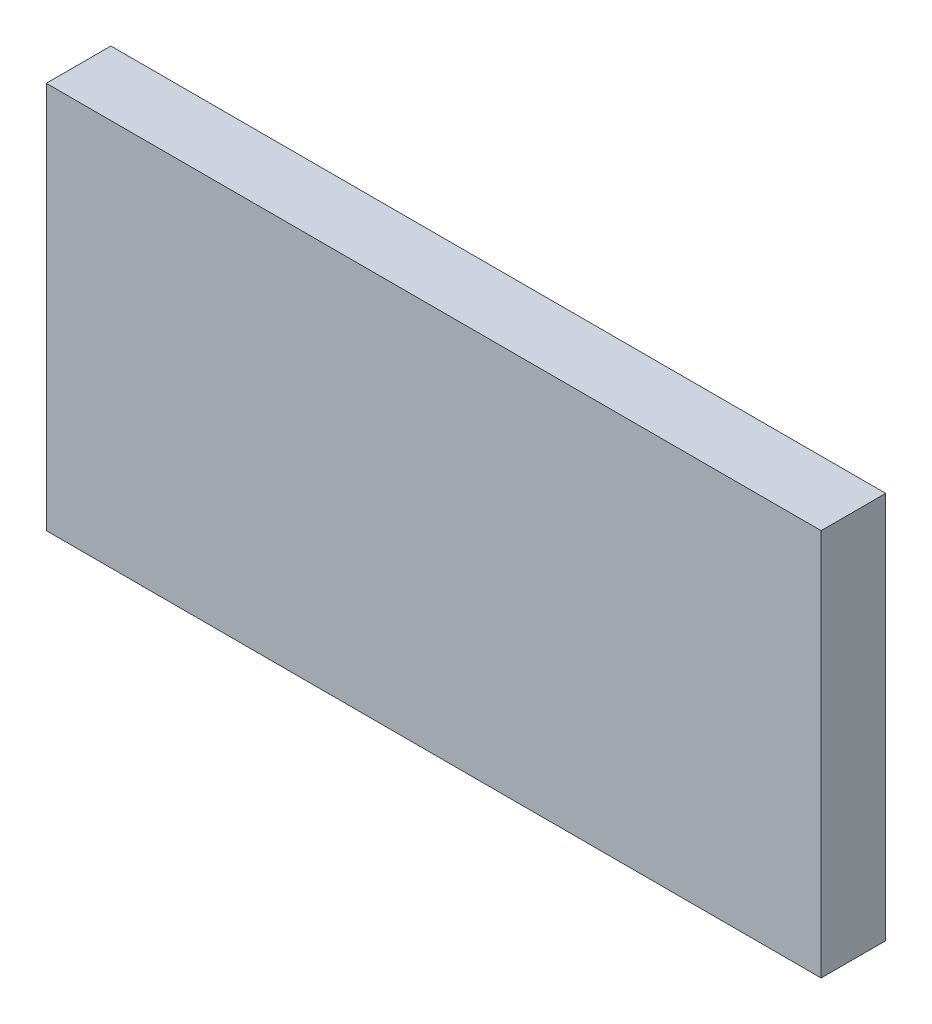
ISO-10303-21;
HEADER;
FILE_DESCRIPTION(('STEP AP214'),'2;1');
FILE_NAME('part.step','',(''),(''),'','','');
FILE_SCHEMA(('AUTOMOTIVE_DESIGN { 1 0 10303 214 1 1 1 1 }'));
ENDSEC;
DATA;
#1=APPLICATION_CONTEXT('core data for automotive mechanical design processes');
#2=APPLICATION_PROTOCOL_DEFINITION('international standard','automotive_design',2000,#1);
#3=PRODUCT_CONTEXT('',#1,'mechanical');
#4=PRODUCT('Part','Part','',(#3));
#5=PRODUCT_RELATED_PRODUCT_CATEGORY('part','',(#4));
#6=PRODUCT_DEFINITION_FORMATION('','',#4);
#7=PRODUCT_DEFINITION_CONTEXT('part definition',#1,'design');
#8=PRODUCT_DEFINITION('design','',#6,#7);
#9=PRODUCT_DEFINITION_SHAPE('','',#8);
#10=(LENGTH_UNIT() NAMED_UNIT(*) SI_UNIT(.MILLI.,.METRE.));
#11=(NAMED_UNIT(*) PLANE_ANGLE_UNIT() SI_UNIT($,.RADIAN.));
#12=(NAMED_UNIT(*) SI_UNIT($,.STERADIAN.) SOLID_ANGLE_UNIT());
#13=UNCERTAINTY_MEASURE_WITH_UNIT(LENGTH_MEASURE(1.E-05),#10,'distance_accuracy_value','');
#14=(GEOMETRIC_REPRESENTATION_CONTEXT(3) GLOBAL_UNCERTAINTY_ASSIGNED_CONTEXT((#13)) GLOBAL_UNIT_ASSIGNED_CONTEXT((#10,
#11,#12)) REPRESENTATION_CONTEXT('',''));
#15=CARTESIAN_POINT('',(0.,0.,0.));
#16=DIRECTION('',(0.,0.,1.));
#17=DIRECTION('',(1.,0.,0.));
#18=AXIS2_PLACEMENT_3D('',#15,#16,#17);
#19=CARTESIAN_POINT('',(60.,30.,10.));
#20=DIRECTION('',(-1.,0.,0.));
#21=DIRECTION('',(0.,-1.,0.));
#22=AXIS2_PLACEMENT_3D('',#19,#20,#21);
#23=PLANE('',#22);
#24=DIRECTION('',(0.,1.,0.));
#25=VECTOR('',#24,1.);
#26=CARTESIAN_POINT('',(60.,30.,0.));
#27=LINE('',#26,#25);
#28=CARTESIAN_POINT('',(60.,-30.,0.));
#29=VERTEX_POINT('',#28);
#30=CARTESIAN_POINT('',(60.,30.,0.));
#31=VERTEX_POINT('',#30);
#32=EDGE_CURVE('E104',#29,#31,#27,.T.);
#33=ORIENTED_EDGE('',*,*,#32,.T.);
#34=DIRECTION('',(0.,0.,-1.));
#35=VECTOR('',#34,1.);
#36=CARTESIAN_POINT('',(60.,30.,10.));
#37=LINE('',#36,#35);
#38=CARTESIAN_POINT('',(60.,30.,10.));
#39=VERTEX_POINT('',#38);
#40=EDGE_CURVE('E11',#39,#31,#37,.T.);
#41=ORIENTED_EDGE('',*,*,#40,.F.);
#42=DIRECTION('',(0.,1.,0.));
#43=VECTOR('',#42,1.);
#44=CARTESIAN_POINT('',(60.,30.,10.));
#45=LINE('',#44,#43);
#46=CARTESIAN_POINT('',(60.,-30.,10.));
#47=VERTEX_POINT('',#46);
#48=EDGE_CURVE('E92',#47,#39,#45,.T.);
#49=ORIENTED_EDGE('',*,*,#48,.F.);
#50=DIRECTION('',(0.,0.,-1.));
#51=VECTOR('',#50,1.);
#52=CARTESIAN_POINT('',(60.,-30.,10.));
#53=LINE('',#52,#51);
#54=EDGE_CURVE('E100',#47,#29,#53,.T.);
#55=ORIENTED_EDGE('',*,*,#54,.T.);
#56=EDGE_LOOP('',(#33,#41,#49,#55));
#57=FACE_BOUND('',#56,.T.);
#58=ADVANCED_FACE('F41',(#57),#23,.F.);
#59=CARTESIAN_POINT('',(-60.,30.,10.));
#60=DIRECTION('',(0.,-1.,0.));
#61=DIRECTION('',(0.,0.,-1.));
#62=AXIS2_PLACEMENT_3D('',#59,#60,#61);
#63=PLANE('',#62);
#64=DIRECTION('',(-1.,0.,0.));
#65=VECTOR('',#64,1.);
#66=CARTESIAN_POINT('',(-60.,30.,0.));
#67=LINE('',#66,#65);
#68=CARTESIAN_POINT('',(-60.,30.,0.));
#69=VERTEX_POINT('',#68);
#70=EDGE_CURVE('E96',#31,#69,#67,.T.);
#71=ORIENTED_EDGE('',*,*,#70,.T.);
#72=DIRECTION('',(0.,0.,-1.));
#73=VECTOR('',#72,1.);
#74=CARTESIAN_POINT('',(-60.,30.,10.));
#75=LINE('',#74,#73);
#76=CARTESIAN_POINT('',(-60.,30.,10.));
#77=VERTEX_POINT('',#76);
#78=EDGE_CURVE('E49',#77,#69,#75,.T.);
#79=ORIENTED_EDGE('',*,*,#78,.F.);
#80=DIRECTION('',(-1.,0.,0.));
#81=VECTOR('',#80,1.);
#82=CARTESIAN_POINT('',(-60.,30.,10.));
#83=LINE('',#82,#81);
#84=EDGE_CURVE('E87',#39,#77,#83,.T.);
#85=ORIENTED_EDGE('',*,*,#84,.F.);
#86=ORIENTED_EDGE('',*,*,#40,.T.);
#87=EDGE_LOOP('',(#71,#79,#85,#86));
#88=FACE_BOUND('',#87,.T.);
#89=ADVANCED_FACE('F95',(#88),#63,.F.);
#90=CARTESIAN_POINT('',(-60.,30.,10.));
#91=DIRECTION('',(1.,0.,0.));
#92=DIRECTION('',(0.,1.,0.));
#93=AXIS2_PLACEMENT_3D('',#90,#91,#92);
#94=PLANE('',#93);
#95=DIRECTION('',(0.,-1.,0.));
#96=VECTOR('',#95,1.);
#97=CARTESIAN_POINT('',(-60.,30.,0.));
#98=LINE('',#97,#96);
#99=CARTESIAN_POINT('',(-60.,-30.,0.));
#100=VERTEX_POINT('',#99);
#101=EDGE_CURVE('E74',#69,#100,#98,.T.);
#102=ORIENTED_EDGE('',*,*,#101,.T.);
#103=DIRECTION('',(0.,0.,-1.));
#104=VECTOR('',#103,1.);
#105=CARTESIAN_POINT('',(-60.,-30.,10.));
#106=LINE('',#105,#104);
#107=CARTESIAN_POINT('',(-60.,-30.,10.));
#108=VERTEX_POINT('',#107);
#109=EDGE_CURVE('E97',#108,#100,#106,.T.);
#110=ORIENTED_EDGE('',*,*,#109,.F.);
#111=DIRECTION('',(0.,-1.,0.));
#112=VECTOR('',#111,1.);
#113=CARTESIAN_POINT('',(-60.,30.,10.));
#114=LINE('',#113,#112);
#115=EDGE_CURVE('E90',#77,#108,#114,.T.);
#116=ORIENTED_EDGE('',*,*,#115,.F.);
#117=ORIENTED_EDGE('',*,*,#78,.T.);
#118=EDGE_LOOP('',(#102,#110,#116,#117));
#119=FACE_BOUND('',#118,.T.);
#120=ADVANCED_FACE('F98',(#119),#94,.F.);
#121=CARTESIAN_POINT('',(-60.,-30.,10.));
#122=DIRECTION('',(0.,1.,0.));
#123=DIRECTION('',(0.,0.,1.));
#124=AXIS2_PLACEMENT_3D('',#121,#122,#123);
#125=PLANE('',#124);
#126=DIRECTION('',(1.,0.,0.));
#127=VECTOR('',#126,1.);
#128=CARTESIAN_POINT('',(-60.,-30.,0.));
#129=LINE('',#128,#127);
#130=EDGE_CURVE('E80',#100,#29,#129,.T.);
#131=ORIENTED_EDGE('',*,*,#130,.T.);
#132=ORIENTED_EDGE('',*,*,#54,.F.);
#133=DIRECTION('',(1.,0.,0.));
#134=VECTOR('',#133,1.);
#135=CARTESIAN_POINT('',(-60.,-30.,10.));
#136=LINE('',#135,#134);
#137=EDGE_CURVE('E57',#108,#47,#136,.T.);
#138=ORIENTED_EDGE('',*,*,#137,.F.);
#139=ORIENTED_EDGE('',*,*,#109,.T.);
#140=EDGE_LOOP('',(#131,#132,#138,#139));
#141=FACE_BOUND('',#140,.T.);
#142=ADVANCED_FACE('F111',(#141),#125,.F.);
#143=CARTESIAN_POINT('',(0.,0.,10.));
#144=DIRECTION('',(0.,0.,1.));
#145=DIRECTION('',(1.,0.,0.));
#146=AXIS2_PLACEMENT_3D('',#143,#144,#145);
#147=PLANE('',#146);
#148=ORIENTED_EDGE('',*,*,#48,.T.);
#149=ORIENTED_EDGE('',*,*,#84,.T.);
#150=ORIENTED_EDGE('',*,*,#115,.T.);
#151=ORIENTED_EDGE('',*,*,#137,.T.);
#152=EDGE_LOOP('',(#148,#149,#150,#151));
#153=FACE_BOUND('',#152,.T.);
#154=ADVANCED_FACE('F88',(#153),#147,.T.);
#155=CARTESIAN_POINT('',(0.,0.,0.));
#156=DIRECTION('',(0.,0.,1.));
#157=DIRECTION('',(1.,0.,0.));
#158=AXIS2_PLACEMENT_3D('',#155,#156,#157);
#159=PLANE('',#158);
#160=ORIENTED_EDGE('',*,*,#32,.F.);
#161=ORIENTED_EDGE('',*,*,#130,.F.);
#162=ORIENTED_EDGE('',*,*,#101,.F.);
#163=ORIENTED_EDGE('',*,*,#70,.F.);
#164=EDGE_LOOP('',(#160,#161,#162,#163));
#165=FACE_BOUND('',#164,.T.);
#166=ADVANCED_FACE('F114',(#165),#159,.F.);
#167=CLOSED_SHELL('',(#58,#89,#120,#142,#154,#166));
#168=MANIFOLD_SOLID_BREP('B2',#167);
#169=ADVANCED_BREP_SHAPE_REPRESENTATION('',(#18,#168),#14);
#170=SHAPE_DEFINITION_REPRESENTATION(#9,#169);
ENDSEC;
END-ISO-10303-21;
